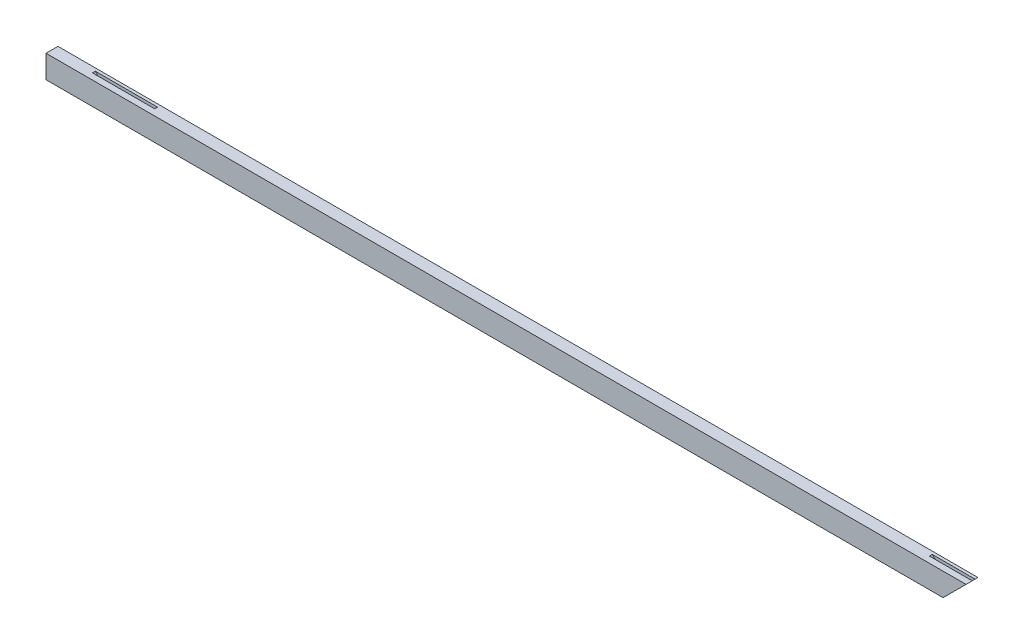
ISO-10303-21;
HEADER;
FILE_DESCRIPTION(('STEP AP214'),'2;1');
FILE_NAME('part.step','',(''),(''),'','','');
FILE_SCHEMA(('AUTOMOTIVE_DESIGN { 1 0 10303 214 1 1 1 1 }'));
ENDSEC;
DATA;
#1=APPLICATION_CONTEXT('core data for automotive mechanical design processes');
#2=APPLICATION_PROTOCOL_DEFINITION('international standard','automotive_design',2000,#1);
#3=PRODUCT_CONTEXT('',#1,'mechanical');
#4=PRODUCT('Part','Part','',(#3));
#5=PRODUCT_RELATED_PRODUCT_CATEGORY('part','',(#4));
#6=PRODUCT_DEFINITION_FORMATION('','',#4);
#7=PRODUCT_DEFINITION_CONTEXT('part definition',#1,'design');
#8=PRODUCT_DEFINITION('design','',#6,#7);
#9=PRODUCT_DEFINITION_SHAPE('','',#8);
#10=(LENGTH_UNIT() NAMED_UNIT(*) SI_UNIT(.MILLI.,.METRE.));
#11=(NAMED_UNIT(*) PLANE_ANGLE_UNIT() SI_UNIT($,.RADIAN.));
#12=(NAMED_UNIT(*) SI_UNIT($,.STERADIAN.) SOLID_ANGLE_UNIT());
#13=UNCERTAINTY_MEASURE_WITH_UNIT(LENGTH_MEASURE(1.E-05),#10,'distance_accuracy_value','');
#14=(GEOMETRIC_REPRESENTATION_CONTEXT(3) GLOBAL_UNCERTAINTY_ASSIGNED_CONTEXT((#13)) GLOBAL_UNIT_ASSIGNED_CONTEXT((#10,
#11,#12)) REPRESENTATION_CONTEXT('',''));
#15=CARTESIAN_POINT('',(0.,0.,0.));
#16=DIRECTION('',(0.,0.,1.));
#17=DIRECTION('',(1.,0.,0.));
#18=AXIS2_PLACEMENT_3D('',#15,#16,#17);
#19=CARTESIAN_POINT('',(1922.,24.,25.));
#20=DIRECTION('',(-0.707106781186552,0.707106781186544,0.));
#21=DIRECTION('',(-0.707106781186544,-0.707106781186551,0.));
#22=AXIS2_PLACEMENT_3D('',#19,#20,#21);
#23=PLANE('',#22);
#24=DIRECTION('',(0.707106781186519,0.707106781186576,0.));
#25=VECTOR('',#24,1.);
#26=CARTESIAN_POINT('',(1914.5,16.5,6.));
#27=LINE('',#26,#25);
#28=CARTESIAN_POINT('',(1914.5,16.5,6.));
#29=VERTEX_POINT('',#28);
#30=CARTESIAN_POINT('',(1922.,24.,6.));
#31=VERTEX_POINT('',#30);
#32=EDGE_CURVE('E188',#29,#31,#27,.T.);
#33=ORIENTED_EDGE('',*,*,#32,.F.);
#34=DIRECTION('',(0.,0.,1.));
#35=VECTOR('',#34,1.);
#36=CARTESIAN_POINT('',(1914.5,16.5,6.));
#37=LINE('',#36,#35);
#38=CARTESIAN_POINT('',(1914.5,16.5,12.));
#39=VERTEX_POINT('',#38);
#40=EDGE_CURVE('E197',#29,#39,#37,.T.);
#41=ORIENTED_EDGE('',*,*,#40,.T.);
#42=DIRECTION('',(0.707106781186519,0.707106781186576,0.));
#43=VECTOR('',#42,1.);
#44=CARTESIAN_POINT('',(1914.5,16.5,12.));
#45=LINE('',#44,#43);
#46=CARTESIAN_POINT('',(1922.,24.,12.));
#47=VERTEX_POINT('',#46);
#48=EDGE_CURVE('E191',#39,#47,#45,.T.);
#49=ORIENTED_EDGE('',*,*,#48,.T.);
#50=DIRECTION('',(0.,0.,-1.));
#51=VECTOR('',#50,1.);
#52=CARTESIAN_POINT('',(1922.,24.,25.));
#53=LINE('',#52,#51);
#54=CARTESIAN_POINT('',(1922.,24.,25.));
#55=VERTEX_POINT('',#54);
#56=EDGE_CURVE('E275',#55,#47,#53,.T.);
#57=ORIENTED_EDGE('',*,*,#56,.F.);
#58=DIRECTION('',(0.707106781186544,0.707106781186551,0.));
#59=VECTOR('',#58,1.);
#60=CARTESIAN_POINT('',(1922.,24.,25.));
#61=LINE('',#60,#59);
#62=CARTESIAN_POINT('',(1874.,-23.9999999999997,25.));
#63=VERTEX_POINT('',#62);
#64=EDGE_CURVE('E256',#63,#55,#61,.T.);
#65=ORIENTED_EDGE('',*,*,#64,.F.);
#66=DIRECTION('',(0.,0.,-1.));
#67=VECTOR('',#66,1.);
#68=CARTESIAN_POINT('',(1874.,-23.9999999999997,25.));
#69=LINE('',#68,#67);
#70=CARTESIAN_POINT('',(1874.,-23.9999999999997,12.));
#71=VERTEX_POINT('',#70);
#72=EDGE_CURVE('E278',#63,#71,#69,.T.);
#73=ORIENTED_EDGE('',*,*,#72,.T.);
#74=DIRECTION('',(0.707106781186544,0.707106781186551,0.));
#75=VECTOR('',#74,1.);
#76=CARTESIAN_POINT('',(1881.5,-16.5,12.));
#77=LINE('',#76,#75);
#78=CARTESIAN_POINT('',(1881.5,-16.5000000000001,12.));
#79=VERTEX_POINT('',#78);
#80=EDGE_CURVE('E218',#71,#79,#77,.T.);
#81=ORIENTED_EDGE('',*,*,#80,.T.);
#82=DIRECTION('',(0.,0.,1.));
#83=VECTOR('',#82,1.);
#84=CARTESIAN_POINT('',(1881.5,-16.5,6.));
#85=LINE('',#84,#83);
#86=CARTESIAN_POINT('',(1881.5,-16.5,6.));
#87=VERTEX_POINT('',#86);
#88=EDGE_CURVE('E214',#87,#79,#85,.T.);
#89=ORIENTED_EDGE('',*,*,#88,.F.);
#90=DIRECTION('',(0.707106781186544,0.707106781186551,0.));
#91=VECTOR('',#90,1.);
#92=CARTESIAN_POINT('',(1881.5,-16.5,6.));
#93=LINE('',#92,#91);
#94=CARTESIAN_POINT('',(1874.,-23.9999999999997,6.));
#95=VERTEX_POINT('',#94);
#96=EDGE_CURVE('E204',#95,#87,#93,.T.);
#97=ORIENTED_EDGE('',*,*,#96,.F.);
#98=CARTESIAN_POINT('',(1874.,-23.9999999999997,0.));
#99=VERTEX_POINT('',#98);
#100=EDGE_CURVE('E277',#95,#99,#69,.T.);
#101=ORIENTED_EDGE('',*,*,#100,.T.);
#102=DIRECTION('',(0.707106781186544,0.707106781186551,0.));
#103=VECTOR('',#102,1.);
#104=CARTESIAN_POINT('',(1922.,24.,0.));
#105=LINE('',#104,#103);
#106=CARTESIAN_POINT('',(1922.,24.,0.));
#107=VERTEX_POINT('',#106);
#108=EDGE_CURVE('E268',#99,#107,#105,.T.);
#109=ORIENTED_EDGE('',*,*,#108,.T.);
#110=EDGE_CURVE('E274',#31,#107,#53,.T.);
#111=ORIENTED_EDGE('',*,*,#110,.F.);
#112=EDGE_LOOP('',(#33,#41,#49,#57,#65,#73,#81,#89,#97,#101,#109,#111));
#113=FACE_BOUND('',#112,.T.);
#114=ADVANCED_FACE('F35',(#113),#23,.F.);
#115=CARTESIAN_POINT('',(0.,24.,25.));
#116=DIRECTION('',(0.,-1.,0.));
#117=DIRECTION('',(0.,0.,-1.));
#118=AXIS2_PLACEMENT_3D('',#115,#116,#117);
#119=PLANE('',#118);
#120=DIRECTION('',(0.,0.,1.));
#121=VECTOR('',#120,1.);
#122=CARTESIAN_POINT('',(84.0000000000001,24.,12.));
#123=LINE('',#122,#121);
#124=CARTESIAN_POINT('',(84.0000000000001,24.,12.));
#125=VERTEX_POINT('',#124);
#126=CARTESIAN_POINT('',(84.0000000000001,24.,6.));
#127=VERTEX_POINT('',#126);
#128=EDGE_CURVE('E319',#125,#127,#123,.F.);
#129=ORIENTED_EDGE('',*,*,#128,.T.);
#130=DIRECTION('',(1.,0.,0.));
#131=VECTOR('',#130,1.);
#132=CARTESIAN_POINT('',(91.5000000000001,24.,6.));
#133=LINE('',#132,#131);
#134=CARTESIAN_POINT('',(214.,24.,6.00000000000002));
#135=VERTEX_POINT('',#134);
#136=EDGE_CURVE('E11',#127,#135,#133,.T.);
#137=ORIENTED_EDGE('',*,*,#136,.T.);
#138=DIRECTION('',(0.,0.,-1.));
#139=VECTOR('',#138,1.);
#140=CARTESIAN_POINT('',(214.,24.,6.00000000000029));
#141=LINE('',#140,#139);
#142=CARTESIAN_POINT('',(214.,24.,12.));
#143=VERTEX_POINT('',#142);
#144=EDGE_CURVE('E307',#135,#143,#141,.F.);
#145=ORIENTED_EDGE('',*,*,#144,.T.);
#146=DIRECTION('',(-1.,0.,0.));
#147=VECTOR('',#146,1.);
#148=CARTESIAN_POINT('',(206.5,24.,12.));
#149=LINE('',#148,#147);
#150=EDGE_CURVE('E284',#143,#125,#149,.T.);
#151=ORIENTED_EDGE('',*,*,#150,.T.);
#152=EDGE_LOOP('',(#129,#137,#145,#151));
#153=FACE_BOUND('',#152,.T.);
#154=DIRECTION('',(-1.,0.,0.));
#155=VECTOR('',#154,1.);
#156=CARTESIAN_POINT('',(1922.,24.,6.));
#157=LINE('',#156,#155);
#158=CARTESIAN_POINT('',(1832.5,24.,6.));
#159=VERTEX_POINT('',#158);
#160=EDGE_CURVE('E183',#31,#159,#157,.T.);
#161=ORIENTED_EDGE('',*,*,#160,.F.);
#162=ORIENTED_EDGE('',*,*,#110,.T.);
#163=DIRECTION('',(-1.,0.,0.));
#164=VECTOR('',#163,1.);
#165=CARTESIAN_POINT('',(0.,24.,0.));
#166=LINE('',#165,#164);
#167=CARTESIAN_POINT('',(0.,24.,0.));
#168=VERTEX_POINT('',#167);
#169=EDGE_CURVE('E254',#107,#168,#166,.T.);
#170=ORIENTED_EDGE('',*,*,#169,.T.);
#171=DIRECTION('',(0.,0.,-1.));
#172=VECTOR('',#171,1.);
#173=CARTESIAN_POINT('',(0.,24.,25.));
#174=LINE('',#173,#172);
#175=CARTESIAN_POINT('',(0.,24.,25.));
#176=VERTEX_POINT('',#175);
#177=EDGE_CURVE('E260',#176,#168,#174,.T.);
#178=ORIENTED_EDGE('',*,*,#177,.F.);
#179=DIRECTION('',(-1.,0.,0.));
#180=VECTOR('',#179,1.);
#181=CARTESIAN_POINT('',(0.,24.,25.));
#182=LINE('',#181,#180);
#183=EDGE_CURVE('E258',#55,#176,#182,.T.);
#184=ORIENTED_EDGE('',*,*,#183,.F.);
#185=ORIENTED_EDGE('',*,*,#56,.T.);
#186=DIRECTION('',(-1.,0.,0.));
#187=VECTOR('',#186,1.);
#188=CARTESIAN_POINT('',(1922.,24.,12.));
#189=LINE('',#188,#187);
#190=CARTESIAN_POINT('',(1832.5,24.,12.));
#191=VERTEX_POINT('',#190);
#192=EDGE_CURVE('E195',#47,#191,#189,.T.);
#193=ORIENTED_EDGE('',*,*,#192,.T.);
#194=DIRECTION('',(0.,0.,1.));
#195=VECTOR('',#194,1.);
#196=CARTESIAN_POINT('',(1832.5,24.,6.));
#197=LINE('',#196,#195);
#198=EDGE_CURVE('E176',#159,#191,#197,.T.);
#199=ORIENTED_EDGE('',*,*,#198,.F.);
#200=EDGE_LOOP('',(#161,#162,#170,#178,#184,#185,#193,#199));
#201=FACE_BOUND('',#200,.T.);
#202=ADVANCED_FACE('F193',(#153,#201),#119,.F.);
#203=CARTESIAN_POINT('',(91.5000000000001,16.5,6.));
#204=DIRECTION('',(0.,0.,-1.));
#205=DIRECTION('',(-1.,0.,0.));
#206=AXIS2_PLACEMENT_3D('',#203,#204,#205);
#207=PLANE('',#206);
#208=ORIENTED_EDGE('',*,*,#136,.F.);
#209=DIRECTION('',(0.707106781186549,-0.707106781186546,0.));
#210=VECTOR('',#209,1.);
#211=CARTESIAN_POINT('',(91.5000000000001,16.5,6.));
#212=LINE('',#211,#210);
#213=CARTESIAN_POINT('',(91.5000000000001,16.5,6.));
#214=VERTEX_POINT('',#213);
#215=EDGE_CURVE('E43',#214,#127,#212,.F.);
#216=ORIENTED_EDGE('',*,*,#215,.F.);
#217=DIRECTION('',(1.,0.,0.));
#218=VECTOR('',#217,1.);
#219=CARTESIAN_POINT('',(91.5000000000001,16.5,6.));
#220=LINE('',#219,#218);
#221=CARTESIAN_POINT('',(206.5,16.5,6.00000000000001));
#222=VERTEX_POINT('',#221);
#223=EDGE_CURVE('E317',#214,#222,#220,.T.);
#224=ORIENTED_EDGE('',*,*,#223,.T.);
#225=DIRECTION('',(-0.707106781186549,-0.707106781186546,0.));
#226=VECTOR('',#225,1.);
#227=CARTESIAN_POINT('',(149.,-41.0000000000001,6.00000000000001));
#228=LINE('',#227,#226);
#229=EDGE_CURVE('E311',#222,#135,#228,.F.);
#230=ORIENTED_EDGE('',*,*,#229,.T.);
#231=EDGE_LOOP('',(#208,#216,#224,#230));
#232=FACE_BOUND('',#231,.T.);
#233=ADVANCED_FACE('F37',(#232),#207,.F.);
#234=CARTESIAN_POINT('',(91.5000000000001,16.5,12.));
#235=DIRECTION('',(0.707106781186546,0.707106781186549,0.));
#236=DIRECTION('',(0.707106781186549,-0.707106781186546,0.));
#237=AXIS2_PLACEMENT_3D('',#234,#235,#236);
#238=PLANE('',#237);
#239=ORIENTED_EDGE('',*,*,#128,.F.);
#240=DIRECTION('',(0.707106781186549,-0.707106781186546,0.));
#241=VECTOR('',#240,1.);
#242=CARTESIAN_POINT('',(149.,-41.,12.));
#243=LINE('',#242,#241);
#244=CARTESIAN_POINT('',(91.5000000000001,16.5,12.));
#245=VERTEX_POINT('',#244);
#246=EDGE_CURVE('E298',#245,#125,#243,.F.);
#247=ORIENTED_EDGE('',*,*,#246,.F.);
#248=DIRECTION('',(0.,0.,-1.));
#249=VECTOR('',#248,1.);
#250=CARTESIAN_POINT('',(91.5000000000001,16.5,12.));
#251=LINE('',#250,#249);
#252=EDGE_CURVE('E314',#245,#214,#251,.T.);
#253=ORIENTED_EDGE('',*,*,#252,.T.);
#254=ORIENTED_EDGE('',*,*,#215,.T.);
#255=EDGE_LOOP('',(#239,#247,#253,#254));
#256=FACE_BOUND('',#255,.T.);
#257=ADVANCED_FACE('F323',(#256),#238,.T.);
#258=CARTESIAN_POINT('',(0.,16.5,0.));
#259=DIRECTION('',(0.,1.,0.));
#260=DIRECTION('',(1.,0.,0.));
#261=AXIS2_PLACEMENT_3D('',#258,#259,#260);
#262=PLANE('',#261);
#263=DIRECTION('',(-1.,0.,0.));
#264=VECTOR('',#263,1.);
#265=CARTESIAN_POINT('',(206.5,16.5,12.));
#266=LINE('',#265,#264);
#267=CARTESIAN_POINT('',(206.5,16.5,12.));
#268=VERTEX_POINT('',#267);
#269=EDGE_CURVE('E301',#268,#245,#266,.T.);
#270=ORIENTED_EDGE('',*,*,#269,.F.);
#271=DIRECTION('',(0.,0.,1.));
#272=VECTOR('',#271,1.);
#273=CARTESIAN_POINT('',(206.5,16.5,6.00000000000001));
#274=LINE('',#273,#272);
#275=EDGE_CURVE('E309',#222,#268,#274,.T.);
#276=ORIENTED_EDGE('',*,*,#275,.F.);
#277=ORIENTED_EDGE('',*,*,#223,.F.);
#278=ORIENTED_EDGE('',*,*,#252,.F.);
#279=EDGE_LOOP('',(#270,#276,#277,#278));
#280=FACE_BOUND('',#279,.T.);
#281=ADVANCED_FACE('F336',(#280),#262,.T.);
#282=CARTESIAN_POINT('',(206.5,16.5,6.00000000000001));
#283=DIRECTION('',(-0.707106781186546,0.707106781186549,0.));
#284=DIRECTION('',(0.707106781186549,0.707106781186546,0.));
#285=AXIS2_PLACEMENT_3D('',#282,#283,#284);
#286=PLANE('',#285);
#287=ORIENTED_EDGE('',*,*,#144,.F.);
#288=ORIENTED_EDGE('',*,*,#229,.F.);
#289=ORIENTED_EDGE('',*,*,#275,.T.);
#290=DIRECTION('',(-0.707106781186549,-0.707106781186546,0.));
#291=VECTOR('',#290,1.);
#292=CARTESIAN_POINT('',(206.5,16.5000000000001,12.));
#293=LINE('',#292,#291);
#294=EDGE_CURVE('E304',#268,#143,#293,.F.);
#295=ORIENTED_EDGE('',*,*,#294,.T.);
#296=EDGE_LOOP('',(#287,#288,#289,#295));
#297=FACE_BOUND('',#296,.T.);
#298=ADVANCED_FACE('F339',(#297),#286,.T.);
#299=CARTESIAN_POINT('',(206.5,16.5,12.));
#300=DIRECTION('',(0.,0.,1.));
#301=DIRECTION('',(1.,0.,0.));
#302=AXIS2_PLACEMENT_3D('',#299,#300,#301);
#303=PLANE('',#302);
#304=ORIENTED_EDGE('',*,*,#150,.F.);
#305=ORIENTED_EDGE('',*,*,#294,.F.);
#306=ORIENTED_EDGE('',*,*,#269,.T.);
#307=ORIENTED_EDGE('',*,*,#246,.T.);
#308=EDGE_LOOP('',(#304,#305,#306,#307));
#309=FACE_BOUND('',#308,.T.);
#310=ADVANCED_FACE('F332',(#309),#303,.F.);
#311=CARTESIAN_POINT('',(0.,-24.,25.));
#312=DIRECTION('',(1.,0.,0.));
#313=DIRECTION('',(0.,1.,0.));
#314=AXIS2_PLACEMENT_3D('',#311,#312,#313);
#315=PLANE('',#314);
#316=DIRECTION('',(0.,-1.,0.));
#317=VECTOR('',#316,1.);
#318=CARTESIAN_POINT('',(0.,-24.,0.));
#319=LINE('',#318,#317);
#320=CARTESIAN_POINT('',(0.,-24.,0.));
#321=VERTEX_POINT('',#320);
#322=EDGE_CURVE('E261',#168,#321,#319,.T.);
#323=ORIENTED_EDGE('',*,*,#322,.T.);
#324=DIRECTION('',(0.,0.,-1.));
#325=VECTOR('',#324,1.);
#326=CARTESIAN_POINT('',(0.,-24.,25.));
#327=LINE('',#326,#325);
#328=CARTESIAN_POINT('',(0.,-24.,25.));
#329=VERTEX_POINT('',#328);
#330=EDGE_CURVE('E281',#329,#321,#327,.T.);
#331=ORIENTED_EDGE('',*,*,#330,.F.);
#332=DIRECTION('',(0.,-1.,0.));
#333=VECTOR('',#332,1.);
#334=CARTESIAN_POINT('',(0.,-24.,25.));
#335=LINE('',#334,#333);
#336=EDGE_CURVE('E250',#176,#329,#335,.T.);
#337=ORIENTED_EDGE('',*,*,#336,.F.);
#338=ORIENTED_EDGE('',*,*,#177,.T.);
#339=EDGE_LOOP('',(#323,#331,#337,#338));
#340=FACE_BOUND('',#339,.T.);
#341=ADVANCED_FACE('F346',(#340),#315,.F.);
#342=CARTESIAN_POINT('',(1874.,-23.9999999999997,25.));
#343=DIRECTION('',(0.,1.,0.));
#344=DIRECTION('',(-1.,0.,0.));
#345=AXIS2_PLACEMENT_3D('',#342,#343,#344);
#346=PLANE('',#345);
#347=DIRECTION('',(0.,0.,1.));
#348=VECTOR('',#347,1.);
#349=CARTESIAN_POINT('',(84.0000000000001,-24.,12.));
#350=LINE('',#349,#348);
#351=CARTESIAN_POINT('',(84.0000000000001,-24.,12.));
#352=VERTEX_POINT('',#351);
#353=CARTESIAN_POINT('',(84.0000000000001,-24.,6.));
#354=VERTEX_POINT('',#353);
#355=EDGE_CURVE('E246',#352,#354,#350,.F.);
#356=ORIENTED_EDGE('',*,*,#355,.F.);
#357=DIRECTION('',(-1.,0.,0.));
#358=VECTOR('',#357,1.);
#359=CARTESIAN_POINT('',(206.5,-24.,12.));
#360=LINE('',#359,#358);
#361=CARTESIAN_POINT('',(214.,-24.,12.));
#362=VERTEX_POINT('',#361);
#363=EDGE_CURVE('E244',#362,#352,#360,.T.);
#364=ORIENTED_EDGE('',*,*,#363,.F.);
#365=DIRECTION('',(0.,0.,-1.));
#366=VECTOR('',#365,1.);
#367=CARTESIAN_POINT('',(214.,-24.,6.00000000000029));
#368=LINE('',#367,#366);
#369=CARTESIAN_POINT('',(214.,-24.,6.00000000000002));
#370=VERTEX_POINT('',#369);
#371=EDGE_CURVE('E234',#370,#362,#368,.F.);
#372=ORIENTED_EDGE('',*,*,#371,.F.);
#373=DIRECTION('',(1.,0.,0.));
#374=VECTOR('',#373,1.);
#375=CARTESIAN_POINT('',(91.5000000000001,-24.,6.));
#376=LINE('',#375,#374);
#377=EDGE_CURVE('E247',#354,#370,#376,.T.);
#378=ORIENTED_EDGE('',*,*,#377,.F.);
#379=EDGE_LOOP('',(#356,#364,#372,#378));
#380=FACE_BOUND('',#379,.T.);
#381=ORIENTED_EDGE('',*,*,#100,.F.);
#382=DIRECTION('',(1.,0.,0.));
#383=VECTOR('',#382,1.);
#384=CARTESIAN_POINT('',(1874.,-23.9999999999997,6.));
#385=LINE('',#384,#383);
#386=CARTESIAN_POINT('',(1832.5,-24.,6.));
#387=VERTEX_POINT('',#386);
#388=EDGE_CURVE('E202',#387,#95,#385,.T.);
#389=ORIENTED_EDGE('',*,*,#388,.F.);
#390=DIRECTION('',(0.,0.,1.));
#391=VECTOR('',#390,1.);
#392=CARTESIAN_POINT('',(1832.5,-24.,6.));
#393=LINE('',#392,#391);
#394=CARTESIAN_POINT('',(1832.5,-24.,12.));
#395=VERTEX_POINT('',#394);
#396=EDGE_CURVE('E224',#387,#395,#393,.T.);
#397=ORIENTED_EDGE('',*,*,#396,.T.);
#398=DIRECTION('',(1.,0.,0.));
#399=VECTOR('',#398,1.);
#400=CARTESIAN_POINT('',(1874.,-23.9999999999997,12.));
#401=LINE('',#400,#399);
#402=EDGE_CURVE('E215',#395,#71,#401,.T.);
#403=ORIENTED_EDGE('',*,*,#402,.T.);
#404=ORIENTED_EDGE('',*,*,#72,.F.);
#405=DIRECTION('',(1.,0.,0.));
#406=VECTOR('',#405,1.);
#407=CARTESIAN_POINT('',(1874.,-23.9999999999997,25.));
#408=LINE('',#407,#406);
#409=EDGE_CURVE('E253',#329,#63,#408,.T.);
#410=ORIENTED_EDGE('',*,*,#409,.F.);
#411=ORIENTED_EDGE('',*,*,#330,.T.);
#412=DIRECTION('',(1.,0.,0.));
#413=VECTOR('',#412,1.);
#414=CARTESIAN_POINT('',(1874.,-23.9999999999997,0.));
#415=LINE('',#414,#413);
#416=EDGE_CURVE('E264',#321,#99,#415,.T.);
#417=ORIENTED_EDGE('',*,*,#416,.T.);
#418=EDGE_LOOP('',(#381,#389,#397,#403,#404,#410,#411,#417));
#419=FACE_BOUND('',#418,.T.);
#420=ADVANCED_FACE('F358',(#380,#419),#346,.F.);
#421=CARTESIAN_POINT('',(0.,0.,25.));
#422=DIRECTION('',(0.,0.,-1.));
#423=DIRECTION('',(-1.,0.,0.));
#424=AXIS2_PLACEMENT_3D('',#421,#422,#423);
#425=PLANE('',#424);
#426=ORIENTED_EDGE('',*,*,#336,.T.);
#427=ORIENTED_EDGE('',*,*,#409,.T.);
#428=ORIENTED_EDGE('',*,*,#64,.T.);
#429=ORIENTED_EDGE('',*,*,#183,.T.);
#430=EDGE_LOOP('',(#426,#427,#428,#429));
#431=FACE_BOUND('',#430,.T.);
#432=ADVANCED_FACE('F361',(#431),#425,.F.);
#433=CARTESIAN_POINT('',(0.,0.,0.));
#434=DIRECTION('',(0.,0.,-1.));
#435=DIRECTION('',(-1.,0.,0.));
#436=AXIS2_PLACEMENT_3D('',#433,#434,#435);
#437=PLANE('',#436);
#438=ORIENTED_EDGE('',*,*,#322,.F.);
#439=ORIENTED_EDGE('',*,*,#169,.F.);
#440=ORIENTED_EDGE('',*,*,#108,.F.);
#441=ORIENTED_EDGE('',*,*,#416,.F.);
#442=EDGE_LOOP('',(#438,#439,#440,#441));
#443=FACE_BOUND('',#442,.T.);
#444=ADVANCED_FACE('F396',(#443),#437,.T.);
#445=CARTESIAN_POINT('',(206.5,-16.5,12.));
#446=DIRECTION('',(0.,0.,1.));
#447=DIRECTION('',(1.,0.,0.));
#448=AXIS2_PLACEMENT_3D('',#445,#446,#447);
#449=PLANE('',#448);
#450=ORIENTED_EDGE('',*,*,#363,.T.);
#451=DIRECTION('',(0.707106781186549,0.707106781186546,0.));
#452=VECTOR('',#451,1.);
#453=CARTESIAN_POINT('',(149.,41.,12.));
#454=LINE('',#453,#452);
#455=CARTESIAN_POINT('',(91.5000000000001,-16.5,12.));
#456=VERTEX_POINT('',#455);
#457=EDGE_CURVE('E243',#456,#352,#454,.F.);
#458=ORIENTED_EDGE('',*,*,#457,.F.);
#459=DIRECTION('',(-1.,0.,0.));
#460=VECTOR('',#459,1.);
#461=CARTESIAN_POINT('',(206.5,-16.5,12.));
#462=LINE('',#461,#460);
#463=CARTESIAN_POINT('',(206.5,-16.5,12.));
#464=VERTEX_POINT('',#463);
#465=EDGE_CURVE('E230',#464,#456,#462,.T.);
#466=ORIENTED_EDGE('',*,*,#465,.F.);
#467=DIRECTION('',(-0.707106781186549,0.707106781186546,0.));
#468=VECTOR('',#467,1.);
#469=CARTESIAN_POINT('',(206.5,-16.5000000000001,12.));
#470=LINE('',#469,#468);
#471=EDGE_CURVE('E265',#464,#362,#470,.F.);
#472=ORIENTED_EDGE('',*,*,#471,.T.);
#473=EDGE_LOOP('',(#450,#458,#466,#472));
#474=FACE_BOUND('',#473,.T.);
#475=ADVANCED_FACE('F370',(#474),#449,.F.);
#476=CARTESIAN_POINT('',(206.5,-16.5,6.00000000000001));
#477=DIRECTION('',(-0.707106781186546,-0.707106781186549,0.));
#478=DIRECTION('',(0.707106781186549,-0.707106781186546,0.));
#479=AXIS2_PLACEMENT_3D('',#476,#477,#478);
#480=PLANE('',#479);
#481=ORIENTED_EDGE('',*,*,#371,.T.);
#482=ORIENTED_EDGE('',*,*,#471,.F.);
#483=DIRECTION('',(0.,0.,1.));
#484=VECTOR('',#483,1.);
#485=CARTESIAN_POINT('',(206.5,-16.5,6.00000000000001));
#486=LINE('',#485,#484);
#487=CARTESIAN_POINT('',(206.5,-16.5,6.00000000000001));
#488=VERTEX_POINT('',#487);
#489=EDGE_CURVE('E240',#488,#464,#486,.T.);
#490=ORIENTED_EDGE('',*,*,#489,.F.);
#491=DIRECTION('',(-0.707106781186549,0.707106781186546,0.));
#492=VECTOR('',#491,1.);
#493=CARTESIAN_POINT('',(149.,41.0000000000001,6.00000000000001));
#494=LINE('',#493,#492);
#495=EDGE_CURVE('E287',#488,#370,#494,.F.);
#496=ORIENTED_EDGE('',*,*,#495,.T.);
#497=EDGE_LOOP('',(#481,#482,#490,#496));
#498=FACE_BOUND('',#497,.T.);
#499=ADVANCED_FACE('F366',(#498),#480,.T.);
#500=CARTESIAN_POINT('',(91.5000000000001,-16.5,6.));
#501=DIRECTION('',(0.,0.,-1.));
#502=DIRECTION('',(-1.,0.,0.));
#503=AXIS2_PLACEMENT_3D('',#500,#501,#502);
#504=PLANE('',#503);
#505=ORIENTED_EDGE('',*,*,#377,.T.);
#506=ORIENTED_EDGE('',*,*,#495,.F.);
#507=DIRECTION('',(1.,0.,0.));
#508=VECTOR('',#507,1.);
#509=CARTESIAN_POINT('',(91.5000000000001,-16.5,6.));
#510=LINE('',#509,#508);
#511=CARTESIAN_POINT('',(91.5000000000001,-16.5,6.));
#512=VERTEX_POINT('',#511);
#513=EDGE_CURVE('E237',#512,#488,#510,.T.);
#514=ORIENTED_EDGE('',*,*,#513,.F.);
#515=DIRECTION('',(0.707106781186549,0.707106781186546,0.));
#516=VECTOR('',#515,1.);
#517=CARTESIAN_POINT('',(91.5000000000001,-16.5,6.));
#518=LINE('',#517,#516);
#519=EDGE_CURVE('E289',#512,#354,#518,.F.);
#520=ORIENTED_EDGE('',*,*,#519,.T.);
#521=EDGE_LOOP('',(#505,#506,#514,#520));
#522=FACE_BOUND('',#521,.T.);
#523=ADVANCED_FACE('F369',(#522),#504,.F.);
#524=CARTESIAN_POINT('',(91.5000000000001,-16.5,12.));
#525=DIRECTION('',(0.707106781186546,-0.707106781186549,0.));
#526=DIRECTION('',(0.707106781186549,0.707106781186546,0.));
#527=AXIS2_PLACEMENT_3D('',#524,#525,#526);
#528=PLANE('',#527);
#529=ORIENTED_EDGE('',*,*,#355,.T.);
#530=ORIENTED_EDGE('',*,*,#519,.F.);
#531=DIRECTION('',(0.,0.,-1.));
#532=VECTOR('',#531,1.);
#533=CARTESIAN_POINT('',(91.5000000000001,-16.5,12.));
#534=LINE('',#533,#532);
#535=EDGE_CURVE('E233',#456,#512,#534,.T.);
#536=ORIENTED_EDGE('',*,*,#535,.F.);
#537=ORIENTED_EDGE('',*,*,#457,.T.);
#538=EDGE_LOOP('',(#529,#530,#536,#537));
#539=FACE_BOUND('',#538,.T.);
#540=ADVANCED_FACE('F372',(#539),#528,.T.);
#541=CARTESIAN_POINT('',(0.,-16.5,0.));
#542=DIRECTION('',(0.,-1.,0.));
#543=DIRECTION('',(1.,0.,0.));
#544=AXIS2_PLACEMENT_3D('',#541,#542,#543);
#545=PLANE('',#544);
#546=ORIENTED_EDGE('',*,*,#465,.T.);
#547=ORIENTED_EDGE('',*,*,#535,.T.);
#548=ORIENTED_EDGE('',*,*,#513,.T.);
#549=ORIENTED_EDGE('',*,*,#489,.T.);
#550=EDGE_LOOP('',(#546,#547,#548,#549));
#551=FACE_BOUND('',#550,.T.);
#552=ADVANCED_FACE('F374',(#551),#545,.T.);
#553=CARTESIAN_POINT('',(1840.,16.5,6.));
#554=DIRECTION('',(0.,-1.,0.));
#555=DIRECTION('',(0.,0.,-1.));
#556=AXIS2_PLACEMENT_3D('',#553,#554,#555);
#557=PLANE('',#556);
#558=DIRECTION('',(1.,0.,0.));
#559=VECTOR('',#558,1.);
#560=CARTESIAN_POINT('',(1840.,16.5,12.));
#561=LINE('',#560,#559);
#562=CARTESIAN_POINT('',(1840.,16.5,12.));
#563=VERTEX_POINT('',#562);
#564=EDGE_CURVE('E587',#563,#39,#561,.T.);
#565=ORIENTED_EDGE('',*,*,#564,.T.);
#566=ORIENTED_EDGE('',*,*,#40,.F.);
#567=DIRECTION('',(1.,0.,0.));
#568=VECTOR('',#567,1.);
#569=CARTESIAN_POINT('',(1840.,16.5,6.));
#570=LINE('',#569,#568);
#571=CARTESIAN_POINT('',(1840.,16.5,6.));
#572=VERTEX_POINT('',#571);
#573=EDGE_CURVE('E182',#572,#29,#570,.T.);
#574=ORIENTED_EDGE('',*,*,#573,.F.);
#575=DIRECTION('',(0.,0.,1.));
#576=VECTOR('',#575,1.);
#577=CARTESIAN_POINT('',(1840.,16.5,6.));
#578=LINE('',#577,#576);
#579=EDGE_CURVE('E178',#572,#563,#578,.T.);
#580=ORIENTED_EDGE('',*,*,#579,.T.);
#581=EDGE_LOOP('',(#565,#566,#574,#580));
#582=FACE_BOUND('',#581,.T.);
#583=ADVANCED_FACE('F380',(#582),#557,.F.);
#584=CARTESIAN_POINT('',(1832.5,24.,6.));
#585=DIRECTION('',(-0.707106781186545,-0.70710678118655,0.));
#586=DIRECTION('',(0.70710678118655,-0.707106781186545,0.));
#587=AXIS2_PLACEMENT_3D('',#584,#585,#586);
#588=PLANE('',#587);
#589=DIRECTION('',(0.70710678118655,-0.707106781186545,0.));
#590=VECTOR('',#589,1.);
#591=CARTESIAN_POINT('',(1832.5,24.,12.));
#592=LINE('',#591,#590);
#593=EDGE_CURVE('E58',#191,#563,#592,.T.);
#594=ORIENTED_EDGE('',*,*,#593,.T.);
#595=ORIENTED_EDGE('',*,*,#579,.F.);
#596=DIRECTION('',(0.70710678118655,-0.707106781186545,0.));
#597=VECTOR('',#596,1.);
#598=CARTESIAN_POINT('',(1832.5,24.,6.));
#599=LINE('',#598,#597);
#600=EDGE_CURVE('E172',#159,#572,#599,.T.);
#601=ORIENTED_EDGE('',*,*,#600,.F.);
#602=ORIENTED_EDGE('',*,*,#198,.T.);
#603=EDGE_LOOP('',(#594,#595,#601,#602));
#604=FACE_BOUND('',#603,.T.);
#605=ADVANCED_FACE('F174',(#604),#588,.F.);
#606=CARTESIAN_POINT('',(0.,0.,6.));
#607=DIRECTION('',(0.,0.,1.));
#608=DIRECTION('',(1.,0.,0.));
#609=AXIS2_PLACEMENT_3D('',#606,#607,#608);
#610=PLANE('',#609);
#611=ORIENTED_EDGE('',*,*,#160,.T.);
#612=ORIENTED_EDGE('',*,*,#600,.T.);
#613=ORIENTED_EDGE('',*,*,#573,.T.);
#614=ORIENTED_EDGE('',*,*,#32,.T.);
#615=EDGE_LOOP('',(#611,#612,#613,#614));
#616=FACE_BOUND('',#615,.T.);
#617=ADVANCED_FACE('F186',(#616),#610,.T.);
#618=CARTESIAN_POINT('',(0.,0.,12.));
#619=DIRECTION('',(0.,0.,1.));
#620=DIRECTION('',(1.,0.,0.));
#621=AXIS2_PLACEMENT_3D('',#618,#619,#620);
#622=PLANE('',#621);
#623=ORIENTED_EDGE('',*,*,#192,.F.);
#624=ORIENTED_EDGE('',*,*,#48,.F.);
#625=ORIENTED_EDGE('',*,*,#564,.F.);
#626=ORIENTED_EDGE('',*,*,#593,.F.);
#627=EDGE_LOOP('',(#623,#624,#625,#626));
#628=FACE_BOUND('',#627,.T.);
#629=ADVANCED_FACE('F439',(#628),#622,.F.);
#630=CARTESIAN_POINT('',(1832.5,-24.,6.));
#631=DIRECTION('',(-0.707106781186544,0.707106781186551,0.));
#632=DIRECTION('',(-0.707106781186551,-0.707106781186544,0.));
#633=AXIS2_PLACEMENT_3D('',#630,#631,#632);
#634=PLANE('',#633);
#635=DIRECTION('',(-0.707106781186551,-0.707106781186544,0.));
#636=VECTOR('',#635,1.);
#637=CARTESIAN_POINT('',(1832.5,-24.,12.));
#638=LINE('',#637,#636);
#639=CARTESIAN_POINT('',(1840.,-16.5,12.));
#640=VERTEX_POINT('',#639);
#641=EDGE_CURVE('E205',#640,#395,#638,.T.);
#642=ORIENTED_EDGE('',*,*,#641,.T.);
#643=ORIENTED_EDGE('',*,*,#396,.F.);
#644=DIRECTION('',(-0.707106781186551,-0.707106781186544,0.));
#645=VECTOR('',#644,1.);
#646=CARTESIAN_POINT('',(1832.5,-24.,6.));
#647=LINE('',#646,#645);
#648=CARTESIAN_POINT('',(1840.,-16.5,6.));
#649=VERTEX_POINT('',#648);
#650=EDGE_CURVE('E211',#649,#387,#647,.T.);
#651=ORIENTED_EDGE('',*,*,#650,.F.);
#652=DIRECTION('',(0.,0.,1.));
#653=VECTOR('',#652,1.);
#654=CARTESIAN_POINT('',(1840.,-16.5,6.));
#655=LINE('',#654,#653);
#656=EDGE_CURVE('E227',#649,#640,#655,.T.);
#657=ORIENTED_EDGE('',*,*,#656,.T.);
#658=EDGE_LOOP('',(#642,#643,#651,#657));
#659=FACE_BOUND('',#658,.T.);
#660=ADVANCED_FACE('F428',(#659),#634,.F.);
#661=CARTESIAN_POINT('',(1840.,-16.5,6.));
#662=DIRECTION('',(0.,1.,0.));
#663=DIRECTION('',(0.,0.,1.));
#664=AXIS2_PLACEMENT_3D('',#661,#662,#663);
#665=PLANE('',#664);
#666=DIRECTION('',(-1.,0.,0.));
#667=VECTOR('',#666,1.);
#668=CARTESIAN_POINT('',(1840.,-16.5,12.));
#669=LINE('',#668,#667);
#670=EDGE_CURVE('E50',#79,#640,#669,.T.);
#671=ORIENTED_EDGE('',*,*,#670,.T.);
#672=ORIENTED_EDGE('',*,*,#656,.F.);
#673=DIRECTION('',(-1.,0.,0.));
#674=VECTOR('',#673,1.);
#675=CARTESIAN_POINT('',(1840.,-16.5,6.));
#676=LINE('',#675,#674);
#677=EDGE_CURVE('E208',#87,#649,#676,.T.);
#678=ORIENTED_EDGE('',*,*,#677,.F.);
#679=ORIENTED_EDGE('',*,*,#88,.T.);
#680=EDGE_LOOP('',(#671,#672,#678,#679));
#681=FACE_BOUND('',#680,.T.);
#682=ADVANCED_FACE('F431',(#681),#665,.F.);
#683=CARTESIAN_POINT('',(0.,0.,6.));
#684=DIRECTION('',(0.,0.,-1.));
#685=DIRECTION('',(-1.,0.,0.));
#686=AXIS2_PLACEMENT_3D('',#683,#684,#685);
#687=PLANE('',#686);
#688=ORIENTED_EDGE('',*,*,#388,.T.);
#689=ORIENTED_EDGE('',*,*,#96,.T.);
#690=ORIENTED_EDGE('',*,*,#677,.T.);
#691=ORIENTED_EDGE('',*,*,#650,.T.);
#692=EDGE_LOOP('',(#688,#689,#690,#691));
#693=FACE_BOUND('',#692,.T.);
#694=ADVANCED_FACE('F425',(#693),#687,.F.);
#695=CARTESIAN_POINT('',(0.,0.,12.));
#696=DIRECTION('',(0.,0.,-1.));
#697=DIRECTION('',(-1.,0.,0.));
#698=AXIS2_PLACEMENT_3D('',#695,#696,#697);
#699=PLANE('',#698);
#700=ORIENTED_EDGE('',*,*,#402,.F.);
#701=ORIENTED_EDGE('',*,*,#641,.F.);
#702=ORIENTED_EDGE('',*,*,#670,.F.);
#703=ORIENTED_EDGE('',*,*,#80,.F.);
#704=EDGE_LOOP('',(#700,#701,#702,#703));
#705=FACE_BOUND('',#704,.T.);
#706=ADVANCED_FACE('F429',(#705),#699,.T.);
#707=CLOSED_SHELL('',(#114,#202,#233,#257,#281,#298,#310,#341,#420,#432,#444,#475,#499,#523,
#540,#552,#583,#605,#617,#629,#660,#682,#694,#706));
#708=MANIFOLD_SOLID_BREP('B2',#707);
#709=ADVANCED_BREP_SHAPE_REPRESENTATION('',(#18,#708),#14);
#710=SHAPE_DEFINITION_REPRESENTATION(#9,#709);
ENDSEC;
END-ISO-10303-21;
